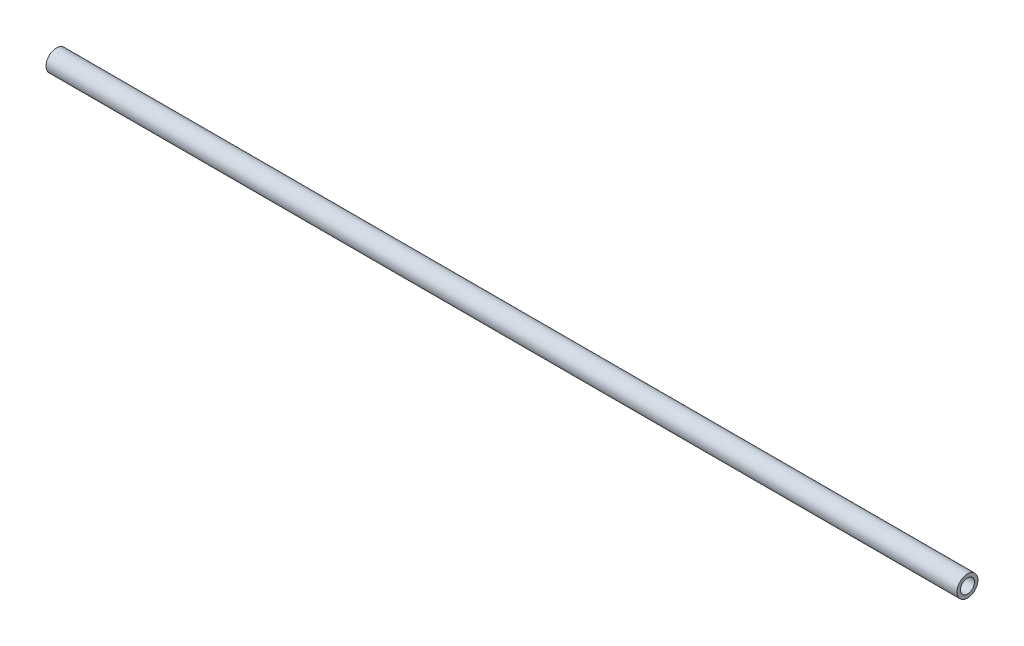
ISO-10303-21;
HEADER;
FILE_DESCRIPTION(('STEP AP214'),'2;1');
FILE_NAME('part.step','',(''),(''),'','','');
FILE_SCHEMA(('AUTOMOTIVE_DESIGN { 1 0 10303 214 1 1 1 1 }'));
ENDSEC;
DATA;
#1=APPLICATION_CONTEXT('core data for automotive mechanical design processes');
#2=APPLICATION_PROTOCOL_DEFINITION('international standard','automotive_design',2000,#1);
#3=PRODUCT_CONTEXT('',#1,'mechanical');
#4=PRODUCT('Part','Part','',(#3));
#5=PRODUCT_RELATED_PRODUCT_CATEGORY('part','',(#4));
#6=PRODUCT_DEFINITION_FORMATION('','',#4);
#7=PRODUCT_DEFINITION_CONTEXT('part definition',#1,'design');
#8=PRODUCT_DEFINITION('design','',#6,#7);
#9=PRODUCT_DEFINITION_SHAPE('','',#8);
#10=(LENGTH_UNIT() NAMED_UNIT(*) SI_UNIT(.MILLI.,.METRE.));
#11=(NAMED_UNIT(*) PLANE_ANGLE_UNIT() SI_UNIT($,.RADIAN.));
#12=(NAMED_UNIT(*) SI_UNIT($,.STERADIAN.) SOLID_ANGLE_UNIT());
#13=UNCERTAINTY_MEASURE_WITH_UNIT(LENGTH_MEASURE(1.E-05),#10,'distance_accuracy_value','');
#14=(GEOMETRIC_REPRESENTATION_CONTEXT(3) GLOBAL_UNCERTAINTY_ASSIGNED_CONTEXT((#13)) GLOBAL_UNIT_ASSIGNED_CONTEXT((#10,
#11,#12)) REPRESENTATION_CONTEXT('',''));
#15=CARTESIAN_POINT('',(0.,0.,0.));
#16=DIRECTION('',(0.,0.,1.));
#17=DIRECTION('',(1.,0.,0.));
#18=AXIS2_PLACEMENT_3D('',#15,#16,#17);
#19=CARTESIAN_POINT('',(130.,0.,0.));
#20=DIRECTION('',(1.,0.,0.));
#21=DIRECTION('',(0.,0.,-1.));
#22=AXIS2_PLACEMENT_3D('',#19,#20,#21);
#23=PLANE('',#22);
#24=CARTESIAN_POINT('',(130.,0.,0.));
#25=DIRECTION('',(1.,0.,0.));
#26=DIRECTION('',(0.,0.,-1.));
#27=AXIS2_PLACEMENT_3D('',#24,#25,#26);
#28=CIRCLE('',#27,1.5);
#29=CARTESIAN_POINT('',(130.,0.,-1.5));
#30=VERTEX_POINT('',#29);
#31=EDGE_CURVE('E10',#30,#30,#28,.T.);
#32=ORIENTED_EDGE('',*,*,#31,.T.);
#33=EDGE_LOOP('',(#32));
#34=FACE_BOUND('',#33,.T.);
#35=CARTESIAN_POINT('',(130.,0.,0.));
#36=DIRECTION('',(1.,0.,0.));
#37=DIRECTION('',(0.,0.,-1.));
#38=AXIS2_PLACEMENT_3D('',#35,#36,#37);
#39=CIRCLE('',#38,1.);
#40=CARTESIAN_POINT('',(130.,0.,-1.));
#41=VERTEX_POINT('',#40);
#42=EDGE_CURVE('E44',#41,#41,#39,.T.);
#43=ORIENTED_EDGE('',*,*,#42,.F.);
#44=EDGE_LOOP('',(#43));
#45=FACE_BOUND('',#44,.T.);
#46=ADVANCED_FACE('F33',(#34,#45),#23,.T.);
#47=CARTESIAN_POINT('',(0.,0.,0.));
#48=DIRECTION('',(1.,0.,0.));
#49=DIRECTION('',(0.,0.,-1.));
#50=AXIS2_PLACEMENT_3D('',#47,#48,#49);
#51=PLANE('',#50);
#52=CARTESIAN_POINT('',(0.,0.,0.));
#53=DIRECTION('',(1.,0.,0.));
#54=DIRECTION('',(0.,0.,-1.));
#55=AXIS2_PLACEMENT_3D('',#52,#53,#54);
#56=CIRCLE('',#55,1.5);
#57=CARTESIAN_POINT('',(0.,0.,-1.5));
#58=VERTEX_POINT('',#57);
#59=EDGE_CURVE('E37',#58,#58,#56,.T.);
#60=ORIENTED_EDGE('',*,*,#59,.F.);
#61=EDGE_LOOP('',(#60));
#62=FACE_BOUND('',#61,.T.);
#63=CARTESIAN_POINT('',(0.,0.,0.));
#64=DIRECTION('',(1.,0.,0.));
#65=DIRECTION('',(0.,0.,-1.));
#66=AXIS2_PLACEMENT_3D('',#63,#64,#65);
#67=CIRCLE('',#66,1.);
#68=CARTESIAN_POINT('',(0.,0.,-1.));
#69=VERTEX_POINT('',#68);
#70=EDGE_CURVE('E46',#69,#69,#67,.T.);
#71=ORIENTED_EDGE('',*,*,#70,.T.);
#72=EDGE_LOOP('',(#71));
#73=FACE_BOUND('',#72,.T.);
#74=ADVANCED_FACE('F56',(#62,#73),#51,.F.);
#75=CARTESIAN_POINT('',(130.,0.,0.));
#76=DIRECTION('',(-1.,0.,0.));
#77=DIRECTION('',(0.,0.,1.));
#78=AXIS2_PLACEMENT_3D('',#75,#76,#77);
#79=CYLINDRICAL_SURFACE('',#78,1.5);
#80=ORIENTED_EDGE('',*,*,#31,.F.);
#81=EDGE_LOOP('',(#80));
#82=FACE_BOUND('',#81,.T.);
#83=ORIENTED_EDGE('',*,*,#59,.T.);
#84=EDGE_LOOP('',(#83));
#85=FACE_BOUND('',#84,.T.);
#86=ADVANCED_FACE('F35',(#82,#85),#79,.T.);
#87=CARTESIAN_POINT('',(130.,0.,0.));
#88=DIRECTION('',(-1.,0.,0.));
#89=DIRECTION('',(0.,0.,1.));
#90=AXIS2_PLACEMENT_3D('',#87,#88,#89);
#91=CYLINDRICAL_SURFACE('',#90,1.);
#92=ORIENTED_EDGE('',*,*,#42,.T.);
#93=EDGE_LOOP('',(#92));
#94=FACE_BOUND('',#93,.T.);
#95=ORIENTED_EDGE('',*,*,#70,.F.);
#96=EDGE_LOOP('',(#95));
#97=FACE_BOUND('',#96,.T.);
#98=ADVANCED_FACE('F52',(#94,#97),#91,.F.);
#99=CLOSED_SHELL('',(#46,#74,#86,#98));
#100=MANIFOLD_SOLID_BREP('B2',#99);
#101=ADVANCED_BREP_SHAPE_REPRESENTATION('',(#18,#100),#14);
#102=SHAPE_DEFINITION_REPRESENTATION(#9,#101);
ENDSEC;
END-ISO-10303-21;
